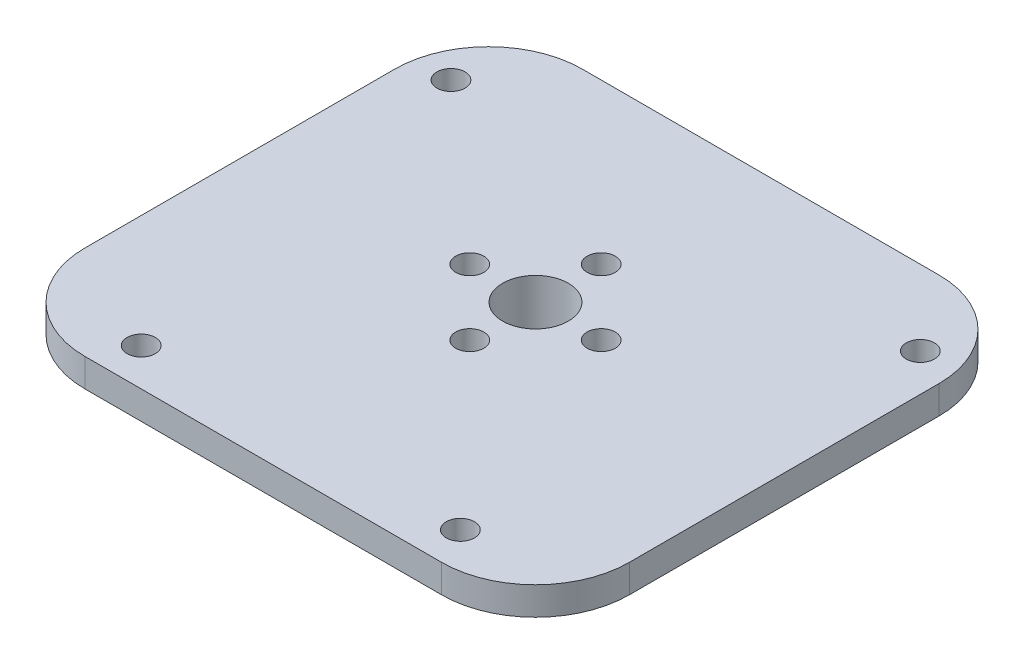
ISO-10303-21;
HEADER;
FILE_DESCRIPTION(('STEP AP214'),'2;1');
FILE_NAME('part.step','',(''),(''),'','','');
FILE_SCHEMA(('AUTOMOTIVE_DESIGN { 1 0 10303 214 1 1 1 1 }'));
ENDSEC;
DATA;
#1=APPLICATION_CONTEXT('core data for automotive mechanical design processes');
#2=APPLICATION_PROTOCOL_DEFINITION('international standard','automotive_design',2000,#1);
#3=PRODUCT_CONTEXT('',#1,'mechanical');
#4=PRODUCT('Part','Part','',(#3));
#5=PRODUCT_RELATED_PRODUCT_CATEGORY('part','',(#4));
#6=PRODUCT_DEFINITION_FORMATION('','',#4);
#7=PRODUCT_DEFINITION_CONTEXT('part definition',#1,'design');
#8=PRODUCT_DEFINITION('design','',#6,#7);
#9=PRODUCT_DEFINITION_SHAPE('','',#8);
#10=(LENGTH_UNIT() NAMED_UNIT(*) SI_UNIT(.MILLI.,.METRE.));
#11=(NAMED_UNIT(*) PLANE_ANGLE_UNIT() SI_UNIT($,.RADIAN.));
#12=(NAMED_UNIT(*) SI_UNIT($,.STERADIAN.) SOLID_ANGLE_UNIT());
#13=UNCERTAINTY_MEASURE_WITH_UNIT(LENGTH_MEASURE(1.E-05),#10,'distance_accuracy_value','');
#14=(GEOMETRIC_REPRESENTATION_CONTEXT(3) GLOBAL_UNCERTAINTY_ASSIGNED_CONTEXT((#13)) GLOBAL_UNIT_ASSIGNED_CONTEXT((#10,
#11,#12)) REPRESENTATION_CONTEXT('',''));
#15=CARTESIAN_POINT('',(0.,0.,0.));
#16=DIRECTION('',(0.,0.,1.));
#17=DIRECTION('',(1.,0.,0.));
#18=AXIS2_PLACEMENT_3D('',#15,#16,#17);
#19=CARTESIAN_POINT('',(0.,0.,0.));
#20=DIRECTION('',(0.,-1.,0.));
#21=DIRECTION('',(0.,0.,-1.));
#22=AXIS2_PLACEMENT_3D('',#19,#20,#21);
#23=PLANE('',#22);
#24=DIRECTION('',(1.,0.,0.));
#25=VECTOR('',#24,1.);
#26=CARTESIAN_POINT('',(-29.,0.,29.));
#27=LINE('',#26,#25);
#28=CARTESIAN_POINT('',(-19.,0.,29.));
#29=VERTEX_POINT('',#28);
#30=CARTESIAN_POINT('',(19.,0.,29.));
#31=VERTEX_POINT('',#30);
#32=EDGE_CURVE('E219',#29,#31,#27,.T.);
#33=ORIENTED_EDGE('',*,*,#32,.F.);
#34=CARTESIAN_POINT('',(-19.,0.,19.));
#35=DIRECTION('',(0.,-1.,0.));
#36=DIRECTION('',(0.,0.,-1.));
#37=AXIS2_PLACEMENT_3D('',#34,#35,#36);
#38=CIRCLE('',#37,10.);
#39=CARTESIAN_POINT('',(-29.,0.,19.));
#40=VERTEX_POINT('',#39);
#41=EDGE_CURVE('E244',#29,#40,#38,.T.);
#42=ORIENTED_EDGE('',*,*,#41,.T.);
#43=DIRECTION('',(0.,0.,1.));
#44=VECTOR('',#43,1.);
#45=CARTESIAN_POINT('',(-29.,0.,29.));
#46=LINE('',#45,#44);
#47=CARTESIAN_POINT('',(-29.,0.,-14.));
#48=VERTEX_POINT('',#47);
#49=EDGE_CURVE('E226',#48,#40,#46,.T.);
#50=ORIENTED_EDGE('',*,*,#49,.F.);
#51=CARTESIAN_POINT('',(-19.,0.,-14.));
#52=DIRECTION('',(0.,-1.,0.));
#53=DIRECTION('',(0.,0.,-1.));
#54=AXIS2_PLACEMENT_3D('',#51,#52,#53);
#55=CIRCLE('',#54,10.);
#56=CARTESIAN_POINT('',(-19.,0.,-24.));
#57=VERTEX_POINT('',#56);
#58=EDGE_CURVE('E142',#48,#57,#55,.T.);
#59=ORIENTED_EDGE('',*,*,#58,.T.);
#60=DIRECTION('',(-1.,0.,0.));
#61=VECTOR('',#60,1.);
#62=CARTESIAN_POINT('',(0.,0.,-24.));
#63=LINE('',#62,#61);
#64=CARTESIAN_POINT('',(-9.99999999999998,0.,-24.));
#65=VERTEX_POINT('',#64);
#66=EDGE_CURVE('E124',#65,#57,#63,.T.);
#67=ORIENTED_EDGE('',*,*,#66,.F.);
#68=CARTESIAN_POINT('',(0.,0.,0.));
#69=DIRECTION('',(0.,-1.,0.));
#70=DIRECTION('',(0.,0.,-1.));
#71=AXIS2_PLACEMENT_3D('',#68,#69,#70);
#72=CIRCLE('',#71,26.);
#73=CARTESIAN_POINT('',(9.99999999999998,0.,-24.));
#74=VERTEX_POINT('',#73);
#75=EDGE_CURVE('E139',#74,#65,#72,.T.);
#76=ORIENTED_EDGE('',*,*,#75,.F.);
#77=CARTESIAN_POINT('',(19.,0.,-24.));
#78=VERTEX_POINT('',#77);
#79=EDGE_CURVE('E143',#78,#74,#63,.T.);
#80=ORIENTED_EDGE('',*,*,#79,.F.);
#81=CARTESIAN_POINT('',(19.,0.,-14.));
#82=DIRECTION('',(0.,-1.,0.));
#83=DIRECTION('',(0.,0.,-1.));
#84=AXIS2_PLACEMENT_3D('',#81,#82,#83);
#85=CIRCLE('',#84,10.);
#86=CARTESIAN_POINT('',(29.,0.,-14.));
#87=VERTEX_POINT('',#86);
#88=EDGE_CURVE('E240',#78,#87,#85,.T.);
#89=ORIENTED_EDGE('',*,*,#88,.T.);
#90=DIRECTION('',(0.,0.,-1.));
#91=VECTOR('',#90,1.);
#92=CARTESIAN_POINT('',(29.,0.,29.));
#93=LINE('',#92,#91);
#94=CARTESIAN_POINT('',(29.,0.,19.));
#95=VERTEX_POINT('',#94);
#96=EDGE_CURVE('E215',#95,#87,#93,.T.);
#97=ORIENTED_EDGE('',*,*,#96,.F.);
#98=CARTESIAN_POINT('',(19.,0.,19.));
#99=DIRECTION('',(0.,-1.,0.));
#100=DIRECTION('',(0.,0.,-1.));
#101=AXIS2_PLACEMENT_3D('',#98,#99,#100);
#102=CIRCLE('',#101,10.);
#103=EDGE_CURVE('E242',#95,#31,#102,.T.);
#104=ORIENTED_EDGE('',*,*,#103,.T.);
#105=EDGE_LOOP('',(#33,#42,#50,#59,#67,#76,#80,#89,#97,#104));
#106=FACE_BOUND('',#105,.T.);
#107=CARTESIAN_POINT('',(-25.,0.,-16.));
#108=DIRECTION('',(0.,1.,0.));
#109=DIRECTION('',(0.,0.,-1.));
#110=AXIS2_PLACEMENT_3D('',#107,#108,#109);
#111=CIRCLE('',#110,1.5);
#112=CARTESIAN_POINT('',(-25.,0.,-17.5));
#113=VERTEX_POINT('',#112);
#114=EDGE_CURVE('E176',#113,#113,#111,.T.);
#115=ORIENTED_EDGE('',*,*,#114,.T.);
#116=EDGE_LOOP('',(#115));
#117=FACE_BOUND('',#116,.T.);
#118=CARTESIAN_POINT('',(17.,0.,25.));
#119=DIRECTION('',(0.,1.,0.));
#120=DIRECTION('',(0.,0.,1.));
#121=AXIS2_PLACEMENT_3D('',#118,#119,#120);
#122=CIRCLE('',#121,1.5);
#123=CARTESIAN_POINT('',(17.,0.,26.5));
#124=VERTEX_POINT('',#123);
#125=EDGE_CURVE('E186',#124,#124,#122,.T.);
#126=ORIENTED_EDGE('',*,*,#125,.T.);
#127=EDGE_LOOP('',(#126));
#128=FACE_BOUND('',#127,.T.);
#129=CARTESIAN_POINT('',(25.,0.,-16.));
#130=DIRECTION('',(0.,1.,0.));
#131=DIRECTION('',(0.,0.,1.));
#132=AXIS2_PLACEMENT_3D('',#129,#130,#131);
#133=CIRCLE('',#132,1.5);
#134=CARTESIAN_POINT('',(25.,0.,-14.5));
#135=VERTEX_POINT('',#134);
#136=EDGE_CURVE('E192',#135,#135,#133,.T.);
#137=ORIENTED_EDGE('',*,*,#136,.T.);
#138=EDGE_LOOP('',(#137));
#139=FACE_BOUND('',#138,.T.);
#140=CARTESIAN_POINT('',(-17.,0.,25.));
#141=DIRECTION('',(0.,1.,0.));
#142=DIRECTION('',(0.,0.,-1.));
#143=AXIS2_PLACEMENT_3D('',#140,#141,#142);
#144=CIRCLE('',#143,1.5);
#145=CARTESIAN_POINT('',(-17.,0.,23.5));
#146=VERTEX_POINT('',#145);
#147=EDGE_CURVE('E180',#146,#146,#144,.T.);
#148=ORIENTED_EDGE('',*,*,#147,.T.);
#149=EDGE_LOOP('',(#148));
#150=FACE_BOUND('',#149,.T.);
#151=ADVANCED_FACE('F43',(#106,#117,#128,#139,#150),#23,.T.);
#152=CARTESIAN_POINT('',(0.,3.,0.));
#153=DIRECTION('',(0.,-1.,0.));
#154=DIRECTION('',(0.,0.,-1.));
#155=AXIS2_PLACEMENT_3D('',#152,#153,#154);
#156=PLANE('',#155);
#157=DIRECTION('',(0.,0.,1.));
#158=VECTOR('',#157,1.);
#159=CARTESIAN_POINT('',(-29.,3.,29.));
#160=LINE('',#159,#158);
#161=CARTESIAN_POINT('',(-29.,3.,-14.));
#162=VERTEX_POINT('',#161);
#163=CARTESIAN_POINT('',(-29.,3.,19.));
#164=VERTEX_POINT('',#163);
#165=EDGE_CURVE('E218',#162,#164,#160,.T.);
#166=ORIENTED_EDGE('',*,*,#165,.T.);
#167=CARTESIAN_POINT('',(-19.,3.,19.));
#168=DIRECTION('',(0.,-1.,0.));
#169=DIRECTION('',(0.,0.,-1.));
#170=AXIS2_PLACEMENT_3D('',#167,#168,#169);
#171=CIRCLE('',#170,10.);
#172=CARTESIAN_POINT('',(-19.,3.,29.));
#173=VERTEX_POINT('',#172);
#174=EDGE_CURVE('E254',#164,#173,#171,.F.);
#175=ORIENTED_EDGE('',*,*,#174,.T.);
#176=DIRECTION('',(1.,0.,0.));
#177=VECTOR('',#176,1.);
#178=CARTESIAN_POINT('',(-29.,3.,29.));
#179=LINE('',#178,#177);
#180=CARTESIAN_POINT('',(19.,3.,29.));
#181=VERTEX_POINT('',#180);
#182=EDGE_CURVE('E132',#173,#181,#179,.T.);
#183=ORIENTED_EDGE('',*,*,#182,.T.);
#184=CARTESIAN_POINT('',(19.,3.,19.));
#185=DIRECTION('',(0.,-1.,0.));
#186=DIRECTION('',(0.,0.,-1.));
#187=AXIS2_PLACEMENT_3D('',#184,#185,#186);
#188=CIRCLE('',#187,10.);
#189=CARTESIAN_POINT('',(29.,3.,19.));
#190=VERTEX_POINT('',#189);
#191=EDGE_CURVE('E252',#181,#190,#188,.F.);
#192=ORIENTED_EDGE('',*,*,#191,.T.);
#193=DIRECTION('',(0.,0.,-1.));
#194=VECTOR('',#193,1.);
#195=CARTESIAN_POINT('',(29.,3.,29.));
#196=LINE('',#195,#194);
#197=CARTESIAN_POINT('',(29.,3.,-14.));
#198=VERTEX_POINT('',#197);
#199=EDGE_CURVE('E216',#190,#198,#196,.T.);
#200=ORIENTED_EDGE('',*,*,#199,.T.);
#201=CARTESIAN_POINT('',(19.,3.,-14.));
#202=DIRECTION('',(0.,-1.,0.));
#203=DIRECTION('',(0.,0.,-1.));
#204=AXIS2_PLACEMENT_3D('',#201,#202,#203);
#205=CIRCLE('',#204,10.);
#206=CARTESIAN_POINT('',(19.,3.,-24.));
#207=VERTEX_POINT('',#206);
#208=EDGE_CURVE('E58',#198,#207,#205,.F.);
#209=ORIENTED_EDGE('',*,*,#208,.T.);
#210=DIRECTION('',(1.,0.,0.));
#211=VECTOR('',#210,1.);
#212=CARTESIAN_POINT('',(29.,3.,-24.));
#213=LINE('',#212,#211);
#214=CARTESIAN_POINT('',(-19.,3.,-24.));
#215=VERTEX_POINT('',#214);
#216=EDGE_CURVE('E261',#215,#207,#213,.T.);
#217=ORIENTED_EDGE('',*,*,#216,.F.);
#218=CARTESIAN_POINT('',(-19.,3.,-14.));
#219=DIRECTION('',(0.,-1.,0.));
#220=DIRECTION('',(0.,0.,-1.));
#221=AXIS2_PLACEMENT_3D('',#218,#219,#220);
#222=CIRCLE('',#221,10.);
#223=EDGE_CURVE('E66',#215,#162,#222,.F.);
#224=ORIENTED_EDGE('',*,*,#223,.T.);
#225=EDGE_LOOP('',(#166,#175,#183,#192,#200,#209,#217,#224));
#226=FACE_BOUND('',#225,.T.);
#227=CARTESIAN_POINT('',(0.,3.,-7.));
#228=DIRECTION('',(0.,1.,0.));
#229=DIRECTION('',(0.,0.,1.));
#230=AXIS2_PLACEMENT_3D('',#227,#228,#229);
#231=CIRCLE('',#230,1.5);
#232=CARTESIAN_POINT('',(0.,3.,-5.5));
#233=VERTEX_POINT('',#232);
#234=EDGE_CURVE('E212',#233,#233,#231,.T.);
#235=ORIENTED_EDGE('',*,*,#234,.F.);
#236=EDGE_LOOP('',(#235));
#237=FACE_BOUND('',#236,.T.);
#238=CARTESIAN_POINT('',(7.,3.,0.));
#239=DIRECTION('',(0.,1.,0.));
#240=DIRECTION('',(0.,0.,1.));
#241=AXIS2_PLACEMENT_3D('',#238,#239,#240);
#242=CIRCLE('',#241,1.5);
#243=CARTESIAN_POINT('',(7.,3.,1.5));
#244=VERTEX_POINT('',#243);
#245=EDGE_CURVE('E209',#244,#244,#242,.T.);
#246=ORIENTED_EDGE('',*,*,#245,.F.);
#247=EDGE_LOOP('',(#246));
#248=FACE_BOUND('',#247,.T.);
#249=CARTESIAN_POINT('',(0.,3.,0.));
#250=DIRECTION('',(0.,1.,0.));
#251=DIRECTION('',(0.,0.,1.));
#252=AXIS2_PLACEMENT_3D('',#249,#250,#251);
#253=CIRCLE('',#252,3.5);
#254=CARTESIAN_POINT('',(0.,3.,3.49999999999999));
#255=VERTEX_POINT('',#254);
#256=EDGE_CURVE('E206',#255,#255,#253,.T.);
#257=ORIENTED_EDGE('',*,*,#256,.F.);
#258=EDGE_LOOP('',(#257));
#259=FACE_BOUND('',#258,.T.);
#260=CARTESIAN_POINT('',(0.,3.,7.));
#261=DIRECTION('',(0.,1.,0.));
#262=DIRECTION('',(0.,0.,-1.));
#263=AXIS2_PLACEMENT_3D('',#260,#261,#262);
#264=CIRCLE('',#263,1.5);
#265=CARTESIAN_POINT('',(0.,3.,5.5));
#266=VERTEX_POINT('',#265);
#267=EDGE_CURVE('E203',#266,#266,#264,.T.);
#268=ORIENTED_EDGE('',*,*,#267,.F.);
#269=EDGE_LOOP('',(#268));
#270=FACE_BOUND('',#269,.T.);
#271=CARTESIAN_POINT('',(-7.,3.,0.));
#272=DIRECTION('',(0.,1.,0.));
#273=DIRECTION('',(0.,0.,-1.));
#274=AXIS2_PLACEMENT_3D('',#271,#272,#273);
#275=CIRCLE('',#274,1.5);
#276=CARTESIAN_POINT('',(-7.,3.,-1.5));
#277=VERTEX_POINT('',#276);
#278=EDGE_CURVE('E198',#277,#277,#275,.T.);
#279=ORIENTED_EDGE('',*,*,#278,.F.);
#280=EDGE_LOOP('',(#279));
#281=FACE_BOUND('',#280,.T.);
#282=CARTESIAN_POINT('',(25.,3.,-16.));
#283=DIRECTION('',(0.,1.,0.));
#284=DIRECTION('',(0.,0.,1.));
#285=AXIS2_PLACEMENT_3D('',#282,#283,#284);
#286=CIRCLE('',#285,1.5);
#287=CARTESIAN_POINT('',(25.,3.,-14.5));
#288=VERTEX_POINT('',#287);
#289=EDGE_CURVE('E195',#288,#288,#286,.T.);
#290=ORIENTED_EDGE('',*,*,#289,.F.);
#291=EDGE_LOOP('',(#290));
#292=FACE_BOUND('',#291,.T.);
#293=CARTESIAN_POINT('',(17.,3.,25.));
#294=DIRECTION('',(0.,1.,0.));
#295=DIRECTION('',(0.,0.,1.));
#296=AXIS2_PLACEMENT_3D('',#293,#294,#295);
#297=CIRCLE('',#296,1.5);
#298=CARTESIAN_POINT('',(17.,3.,26.5));
#299=VERTEX_POINT('',#298);
#300=EDGE_CURVE('E189',#299,#299,#297,.T.);
#301=ORIENTED_EDGE('',*,*,#300,.F.);
#302=EDGE_LOOP('',(#301));
#303=FACE_BOUND('',#302,.T.);
#304=CARTESIAN_POINT('',(-17.,3.,25.));
#305=DIRECTION('',(0.,1.,0.));
#306=DIRECTION('',(0.,0.,-1.));
#307=AXIS2_PLACEMENT_3D('',#304,#305,#306);
#308=CIRCLE('',#307,1.5);
#309=CARTESIAN_POINT('',(-17.,3.,23.5));
#310=VERTEX_POINT('',#309);
#311=EDGE_CURVE('E183',#310,#310,#308,.T.);
#312=ORIENTED_EDGE('',*,*,#311,.F.);
#313=EDGE_LOOP('',(#312));
#314=FACE_BOUND('',#313,.T.);
#315=CARTESIAN_POINT('',(-25.,3.,-16.));
#316=DIRECTION('',(0.,1.,0.));
#317=DIRECTION('',(0.,0.,-1.));
#318=AXIS2_PLACEMENT_3D('',#315,#316,#317);
#319=CIRCLE('',#318,1.5);
#320=CARTESIAN_POINT('',(-25.,3.,-17.5));
#321=VERTEX_POINT('',#320);
#322=EDGE_CURVE('E177',#321,#321,#319,.T.);
#323=ORIENTED_EDGE('',*,*,#322,.F.);
#324=EDGE_LOOP('',(#323));
#325=FACE_BOUND('',#324,.T.);
#326=ADVANCED_FACE('F263',(#226,#237,#248,#259,#270,#281,#292,#303,#314,#325),#156,.F.);
#327=CARTESIAN_POINT('',(29.,3.,29.));
#328=DIRECTION('',(-1.,0.,0.));
#329=DIRECTION('',(0.,0.,1.));
#330=AXIS2_PLACEMENT_3D('',#327,#328,#329);
#331=PLANE('',#330);
#332=ORIENTED_EDGE('',*,*,#199,.F.);
#333=DIRECTION('',(0.,-1.,0.));
#334=VECTOR('',#333,1.);
#335=CARTESIAN_POINT('',(29.,3.,19.));
#336=LINE('',#335,#334);
#337=EDGE_CURVE('E259',#190,#95,#336,.T.);
#338=ORIENTED_EDGE('',*,*,#337,.T.);
#339=ORIENTED_EDGE('',*,*,#96,.T.);
#340=DIRECTION('',(0.,1.,0.));
#341=VECTOR('',#340,1.);
#342=CARTESIAN_POINT('',(29.,3.,-14.));
#343=LINE('',#342,#341);
#344=EDGE_CURVE('E256',#87,#198,#343,.T.);
#345=ORIENTED_EDGE('',*,*,#344,.T.);
#346=EDGE_LOOP('',(#332,#338,#339,#345));
#347=FACE_BOUND('',#346,.T.);
#348=ADVANCED_FACE('F285',(#347),#331,.F.);
#349=CARTESIAN_POINT('',(-29.,3.,29.));
#350=DIRECTION('',(1.,0.,0.));
#351=DIRECTION('',(0.,0.,-1.));
#352=AXIS2_PLACEMENT_3D('',#349,#350,#351);
#353=PLANE('',#352);
#354=ORIENTED_EDGE('',*,*,#49,.T.);
#355=DIRECTION('',(0.,-1.,0.));
#356=VECTOR('',#355,1.);
#357=CARTESIAN_POINT('',(-29.,3.,19.));
#358=LINE('',#357,#356);
#359=EDGE_CURVE('E248',#40,#164,#358,.F.);
#360=ORIENTED_EDGE('',*,*,#359,.T.);
#361=ORIENTED_EDGE('',*,*,#165,.F.);
#362=DIRECTION('',(0.,1.,0.));
#363=VECTOR('',#362,1.);
#364=CARTESIAN_POINT('',(-29.,3.,-14.));
#365=LINE('',#364,#363);
#366=EDGE_CURVE('E246',#162,#48,#365,.F.);
#367=ORIENTED_EDGE('',*,*,#366,.T.);
#368=EDGE_LOOP('',(#354,#360,#361,#367));
#369=FACE_BOUND('',#368,.T.);
#370=ADVANCED_FACE('F270',(#369),#353,.F.);
#371=CARTESIAN_POINT('',(-29.,3.,29.));
#372=DIRECTION('',(0.,0.,-1.));
#373=DIRECTION('',(-1.,0.,0.));
#374=AXIS2_PLACEMENT_3D('',#371,#372,#373);
#375=PLANE('',#374);
#376=ORIENTED_EDGE('',*,*,#182,.F.);
#377=DIRECTION('',(0.,-1.,0.));
#378=VECTOR('',#377,1.);
#379=CARTESIAN_POINT('',(-19.,3.,29.));
#380=LINE('',#379,#378);
#381=EDGE_CURVE('E236',#173,#29,#380,.T.);
#382=ORIENTED_EDGE('',*,*,#381,.T.);
#383=ORIENTED_EDGE('',*,*,#32,.T.);
#384=DIRECTION('',(0.,-1.,0.));
#385=VECTOR('',#384,1.);
#386=CARTESIAN_POINT('',(19.,3.,29.));
#387=LINE('',#386,#385);
#388=EDGE_CURVE('E234',#31,#181,#387,.F.);
#389=ORIENTED_EDGE('',*,*,#388,.T.);
#390=EDGE_LOOP('',(#376,#382,#383,#389));
#391=FACE_BOUND('',#390,.T.);
#392=ADVANCED_FACE('F289',(#391),#375,.F.);
#393=CARTESIAN_POINT('',(0.,3.,-7.));
#394=DIRECTION('',(0.,-1.,0.));
#395=DIRECTION('',(0.,0.,-1.));
#396=AXIS2_PLACEMENT_3D('',#393,#394,#395);
#397=CYLINDRICAL_SURFACE('',#396,1.5);
#398=ORIENTED_EDGE('',*,*,#234,.T.);
#399=EDGE_LOOP('',(#398));
#400=FACE_BOUND('',#399,.T.);
#401=CARTESIAN_POINT('',(0.,-5.,-7.));
#402=DIRECTION('',(0.,-1.,0.));
#403=DIRECTION('',(0.,0.,-1.));
#404=AXIS2_PLACEMENT_3D('',#401,#402,#403);
#405=CIRCLE('',#404,1.5);
#406=CARTESIAN_POINT('',(0.,-5.,-8.5));
#407=VERTEX_POINT('',#406);
#408=EDGE_CURVE('E170',#407,#407,#405,.F.);
#409=ORIENTED_EDGE('',*,*,#408,.F.);
#410=EDGE_LOOP('',(#409));
#411=FACE_BOUND('',#410,.T.);
#412=ADVANCED_FACE('F292',(#400,#411),#397,.F.);
#413=CARTESIAN_POINT('',(7.,3.,0.));
#414=DIRECTION('',(0.,-1.,0.));
#415=DIRECTION('',(0.,0.,-1.));
#416=AXIS2_PLACEMENT_3D('',#413,#414,#415);
#417=CYLINDRICAL_SURFACE('',#416,1.5);
#418=ORIENTED_EDGE('',*,*,#245,.T.);
#419=EDGE_LOOP('',(#418));
#420=FACE_BOUND('',#419,.T.);
#421=CARTESIAN_POINT('',(7.,-5.,0.));
#422=DIRECTION('',(0.,-1.,0.));
#423=DIRECTION('',(0.,0.,-1.));
#424=AXIS2_PLACEMENT_3D('',#421,#422,#423);
#425=CIRCLE('',#424,1.5);
#426=CARTESIAN_POINT('',(7.,-5.,-1.5));
#427=VERTEX_POINT('',#426);
#428=EDGE_CURVE('E173',#427,#427,#425,.F.);
#429=ORIENTED_EDGE('',*,*,#428,.F.);
#430=EDGE_LOOP('',(#429));
#431=FACE_BOUND('',#430,.T.);
#432=ADVANCED_FACE('F374',(#420,#431),#417,.F.);
#433=CARTESIAN_POINT('',(0.,3.,0.));
#434=DIRECTION('',(0.,-1.,0.));
#435=DIRECTION('',(0.,0.,-1.));
#436=AXIS2_PLACEMENT_3D('',#433,#434,#435);
#437=CYLINDRICAL_SURFACE('',#436,3.5);
#438=ORIENTED_EDGE('',*,*,#256,.T.);
#439=EDGE_LOOP('',(#438));
#440=FACE_BOUND('',#439,.T.);
#441=CARTESIAN_POINT('',(0.,-5.,0.));
#442=DIRECTION('',(0.,-1.,0.));
#443=DIRECTION('',(0.,0.,-1.));
#444=AXIS2_PLACEMENT_3D('',#441,#442,#443);
#445=CIRCLE('',#444,3.5);
#446=CARTESIAN_POINT('',(0.,-5.,-3.50000000000001));
#447=VERTEX_POINT('',#446);
#448=EDGE_CURVE('E164',#447,#447,#445,.F.);
#449=ORIENTED_EDGE('',*,*,#448,.F.);
#450=EDGE_LOOP('',(#449));
#451=FACE_BOUND('',#450,.T.);
#452=ADVANCED_FACE('F370',(#440,#451),#437,.F.);
#453=CARTESIAN_POINT('',(0.,3.,7.));
#454=DIRECTION('',(0.,-1.,0.));
#455=DIRECTION('',(0.,0.,-1.));
#456=AXIS2_PLACEMENT_3D('',#453,#454,#455);
#457=CYLINDRICAL_SURFACE('',#456,1.5);
#458=ORIENTED_EDGE('',*,*,#267,.T.);
#459=EDGE_LOOP('',(#458));
#460=FACE_BOUND('',#459,.T.);
#461=CARTESIAN_POINT('',(0.,-5.,7.));
#462=DIRECTION('',(0.,-1.,0.));
#463=DIRECTION('',(0.,0.,-1.));
#464=AXIS2_PLACEMENT_3D('',#461,#462,#463);
#465=CIRCLE('',#464,1.5);
#466=CARTESIAN_POINT('',(0.,-5.,5.5));
#467=VERTEX_POINT('',#466);
#468=EDGE_CURVE('E161',#467,#467,#465,.F.);
#469=ORIENTED_EDGE('',*,*,#468,.F.);
#470=EDGE_LOOP('',(#469));
#471=FACE_BOUND('',#470,.T.);
#472=ADVANCED_FACE('F366',(#460,#471),#457,.F.);
#473=CARTESIAN_POINT('',(-7.,3.,0.));
#474=DIRECTION('',(0.,-1.,0.));
#475=DIRECTION('',(0.,0.,-1.));
#476=AXIS2_PLACEMENT_3D('',#473,#474,#475);
#477=CYLINDRICAL_SURFACE('',#476,1.5);
#478=ORIENTED_EDGE('',*,*,#278,.T.);
#479=EDGE_LOOP('',(#478));
#480=FACE_BOUND('',#479,.T.);
#481=CARTESIAN_POINT('',(-7.,-5.,0.));
#482=DIRECTION('',(0.,-1.,0.));
#483=DIRECTION('',(0.,0.,-1.));
#484=AXIS2_PLACEMENT_3D('',#481,#482,#483);
#485=CIRCLE('',#484,1.5);
#486=CARTESIAN_POINT('',(-7.,-5.,-1.5));
#487=VERTEX_POINT('',#486);
#488=EDGE_CURVE('E167',#487,#487,#485,.F.);
#489=ORIENTED_EDGE('',*,*,#488,.F.);
#490=EDGE_LOOP('',(#489));
#491=FACE_BOUND('',#490,.T.);
#492=ADVANCED_FACE('F362',(#480,#491),#477,.F.);
#493=CARTESIAN_POINT('',(25.,3.,-16.));
#494=DIRECTION('',(0.,-1.,0.));
#495=DIRECTION('',(0.,0.,-1.));
#496=AXIS2_PLACEMENT_3D('',#493,#494,#495);
#497=CYLINDRICAL_SURFACE('',#496,1.5);
#498=ORIENTED_EDGE('',*,*,#289,.T.);
#499=EDGE_LOOP('',(#498));
#500=FACE_BOUND('',#499,.T.);
#501=ORIENTED_EDGE('',*,*,#136,.F.);
#502=EDGE_LOOP('',(#501));
#503=FACE_BOUND('',#502,.T.);
#504=ADVANCED_FACE('F358',(#500,#503),#497,.F.);
#505=CARTESIAN_POINT('',(17.,3.,25.));
#506=DIRECTION('',(0.,-1.,0.));
#507=DIRECTION('',(0.,0.,-1.));
#508=AXIS2_PLACEMENT_3D('',#505,#506,#507);
#509=CYLINDRICAL_SURFACE('',#508,1.5);
#510=ORIENTED_EDGE('',*,*,#300,.T.);
#511=EDGE_LOOP('',(#510));
#512=FACE_BOUND('',#511,.T.);
#513=ORIENTED_EDGE('',*,*,#125,.F.);
#514=EDGE_LOOP('',(#513));
#515=FACE_BOUND('',#514,.T.);
#516=ADVANCED_FACE('F354',(#512,#515),#509,.F.);
#517=CARTESIAN_POINT('',(-17.,3.,25.));
#518=DIRECTION('',(0.,-1.,0.));
#519=DIRECTION('',(0.,0.,-1.));
#520=AXIS2_PLACEMENT_3D('',#517,#518,#519);
#521=CYLINDRICAL_SURFACE('',#520,1.5);
#522=ORIENTED_EDGE('',*,*,#311,.T.);
#523=EDGE_LOOP('',(#522));
#524=FACE_BOUND('',#523,.T.);
#525=ORIENTED_EDGE('',*,*,#147,.F.);
#526=EDGE_LOOP('',(#525));
#527=FACE_BOUND('',#526,.T.);
#528=ADVANCED_FACE('F350',(#524,#527),#521,.F.);
#529=CARTESIAN_POINT('',(-25.,3.,-16.));
#530=DIRECTION('',(0.,-1.,0.));
#531=DIRECTION('',(0.,0.,-1.));
#532=AXIS2_PLACEMENT_3D('',#529,#530,#531);
#533=CYLINDRICAL_SURFACE('',#532,1.5);
#534=ORIENTED_EDGE('',*,*,#322,.T.);
#535=EDGE_LOOP('',(#534));
#536=FACE_BOUND('',#535,.T.);
#537=ORIENTED_EDGE('',*,*,#114,.F.);
#538=EDGE_LOOP('',(#537));
#539=FACE_BOUND('',#538,.T.);
#540=ADVANCED_FACE('F346',(#536,#539),#533,.F.);
#541=CARTESIAN_POINT('',(0.,-5.,0.));
#542=DIRECTION('',(0.,-1.,0.));
#543=DIRECTION('',(0.,0.,-1.));
#544=AXIS2_PLACEMENT_3D('',#541,#542,#543);
#545=PLANE('',#544);
#546=ORIENTED_EDGE('',*,*,#468,.T.);
#547=EDGE_LOOP('',(#546));
#548=FACE_BOUND('',#547,.T.);
#549=ORIENTED_EDGE('',*,*,#448,.T.);
#550=EDGE_LOOP('',(#549));
#551=FACE_BOUND('',#550,.T.);
#552=ORIENTED_EDGE('',*,*,#488,.T.);
#553=EDGE_LOOP('',(#552));
#554=FACE_BOUND('',#553,.T.);
#555=ORIENTED_EDGE('',*,*,#408,.T.);
#556=EDGE_LOOP('',(#555));
#557=FACE_BOUND('',#556,.T.);
#558=ORIENTED_EDGE('',*,*,#428,.T.);
#559=EDGE_LOOP('',(#558));
#560=FACE_BOUND('',#559,.T.);
#561=CARTESIAN_POINT('',(0.,-5.,0.));
#562=DIRECTION('',(0.,-1.,0.));
#563=DIRECTION('',(0.,0.,-1.));
#564=AXIS2_PLACEMENT_3D('',#561,#562,#563);
#565=CIRCLE('',#564,12.5);
#566=CARTESIAN_POINT('',(0.,-5.,-12.5));
#567=VERTEX_POINT('',#566);
#568=EDGE_CURVE('E158',#567,#567,#565,.F.);
#569=ORIENTED_EDGE('',*,*,#568,.F.);
#570=EDGE_LOOP('',(#569));
#571=FACE_BOUND('',#570,.T.);
#572=ADVANCED_FACE('F333',(#548,#551,#554,#557,#560,#571),#545,.T.);
#573=CARTESIAN_POINT('',(0.,-7.,0.));
#574=DIRECTION('',(0.,-1.,0.));
#575=DIRECTION('',(0.,0.,-1.));
#576=AXIS2_PLACEMENT_3D('',#573,#574,#575);
#577=PLANE('',#576);
#578=CARTESIAN_POINT('',(0.,-7.,0.));
#579=DIRECTION('',(0.,-1.,0.));
#580=DIRECTION('',(0.,0.,-1.));
#581=AXIS2_PLACEMENT_3D('',#578,#579,#580);
#582=CIRCLE('',#581,17.);
#583=CARTESIAN_POINT('',(0.,-7.,-17.));
#584=VERTEX_POINT('',#583);
#585=EDGE_CURVE('E155',#584,#584,#582,.T.);
#586=ORIENTED_EDGE('',*,*,#585,.T.);
#587=EDGE_LOOP('',(#586));
#588=FACE_BOUND('',#587,.T.);
#589=CARTESIAN_POINT('',(0.,-7.,0.));
#590=DIRECTION('',(0.,-1.,0.));
#591=DIRECTION('',(0.,0.,-1.));
#592=AXIS2_PLACEMENT_3D('',#589,#590,#591);
#593=CIRCLE('',#592,12.5);
#594=CARTESIAN_POINT('',(0.,-7.,-12.5));
#595=VERTEX_POINT('',#594);
#596=EDGE_CURVE('E152',#595,#595,#593,.T.);
#597=ORIENTED_EDGE('',*,*,#596,.F.);
#598=EDGE_LOOP('',(#597));
#599=FACE_BOUND('',#598,.T.);
#600=ADVANCED_FACE('F327',(#588,#599),#577,.T.);
#601=CARTESIAN_POINT('',(0.,-7.,0.));
#602=DIRECTION('',(0.,1.,0.));
#603=DIRECTION('',(0.,0.,1.));
#604=AXIS2_PLACEMENT_3D('',#601,#602,#603);
#605=CYLINDRICAL_SURFACE('',#604,17.);
#606=CARTESIAN_POINT('',(0.,-2.,0.));
#607=DIRECTION('',(0.,-1.,0.));
#608=DIRECTION('',(0.,0.,-1.));
#609=AXIS2_PLACEMENT_3D('',#606,#607,#608);
#610=CIRCLE('',#609,17.);
#611=CARTESIAN_POINT('',(0.,-2.,-17.));
#612=VERTEX_POINT('',#611);
#613=EDGE_CURVE('E149',#612,#612,#610,.T.);
#614=ORIENTED_EDGE('',*,*,#613,.T.);
#615=EDGE_LOOP('',(#614));
#616=FACE_BOUND('',#615,.T.);
#617=ORIENTED_EDGE('',*,*,#585,.F.);
#618=EDGE_LOOP('',(#617));
#619=FACE_BOUND('',#618,.T.);
#620=ADVANCED_FACE('F324',(#616,#619),#605,.T.);
#621=CARTESIAN_POINT('',(0.,-7.,0.));
#622=DIRECTION('',(0.,1.,0.));
#623=DIRECTION('',(0.,0.,1.));
#624=AXIS2_PLACEMENT_3D('',#621,#622,#623);
#625=CYLINDRICAL_SURFACE('',#624,12.5);
#626=ORIENTED_EDGE('',*,*,#568,.T.);
#627=EDGE_LOOP('',(#626));
#628=FACE_BOUND('',#627,.T.);
#629=ORIENTED_EDGE('',*,*,#596,.T.);
#630=EDGE_LOOP('',(#629));
#631=FACE_BOUND('',#630,.T.);
#632=ADVANCED_FACE('F320',(#628,#631),#625,.F.);
#633=CARTESIAN_POINT('',(0.,-2.,0.));
#634=DIRECTION('',(0.,-1.,0.));
#635=DIRECTION('',(0.,0.,-1.));
#636=AXIS2_PLACEMENT_3D('',#633,#634,#635);
#637=PLANE('',#636);
#638=DIRECTION('',(-1.,0.,0.));
#639=VECTOR('',#638,1.);
#640=CARTESIAN_POINT('',(0.,-2.,-24.));
#641=LINE('',#640,#639);
#642=CARTESIAN_POINT('',(9.99999999999998,-2.,-24.));
#643=VERTEX_POINT('',#642);
#644=CARTESIAN_POINT('',(-9.99999999999998,-2.,-24.));
#645=VERTEX_POINT('',#644);
#646=EDGE_CURVE('E126',#643,#645,#641,.T.);
#647=ORIENTED_EDGE('',*,*,#646,.F.);
#648=CARTESIAN_POINT('',(0.,-2.,0.));
#649=DIRECTION('',(0.,-1.,0.));
#650=DIRECTION('',(0.,0.,-1.));
#651=AXIS2_PLACEMENT_3D('',#648,#649,#650);
#652=CIRCLE('',#651,26.);
#653=EDGE_CURVE('E147',#643,#645,#652,.T.);
#654=ORIENTED_EDGE('',*,*,#653,.T.);
#655=EDGE_LOOP('',(#647,#654));
#656=FACE_BOUND('',#655,.T.);
#657=ORIENTED_EDGE('',*,*,#613,.F.);
#658=EDGE_LOOP('',(#657));
#659=FACE_BOUND('',#658,.T.);
#660=ADVANCED_FACE('F317',(#656,#659),#637,.T.);
#661=CARTESIAN_POINT('',(0.,-2.,0.));
#662=DIRECTION('',(0.,1.,0.));
#663=DIRECTION('',(0.,0.,1.));
#664=AXIS2_PLACEMENT_3D('',#661,#662,#663);
#665=CYLINDRICAL_SURFACE('',#664,26.);
#666=ORIENTED_EDGE('',*,*,#653,.F.);
#667=DIRECTION('',(0.,1.,0.));
#668=VECTOR('',#667,1.);
#669=CARTESIAN_POINT('',(9.99999999999998,-2.,-24.));
#670=LINE('',#669,#668);
#671=EDGE_CURVE('E131',#643,#74,#670,.T.);
#672=ORIENTED_EDGE('',*,*,#671,.T.);
#673=ORIENTED_EDGE('',*,*,#75,.T.);
#674=DIRECTION('',(0.,1.,0.));
#675=VECTOR('',#674,1.);
#676=CARTESIAN_POINT('',(-9.99999999999998,-2.,-24.));
#677=LINE('',#676,#675);
#678=EDGE_CURVE('E121',#65,#645,#677,.F.);
#679=ORIENTED_EDGE('',*,*,#678,.T.);
#680=EDGE_LOOP('',(#666,#672,#673,#679));
#681=FACE_BOUND('',#680,.T.);
#682=ADVANCED_FACE('F146',(#681),#665,.T.);
#683=CARTESIAN_POINT('',(29.,-7.,-24.));
#684=DIRECTION('',(0.,0.,1.));
#685=DIRECTION('',(1.,0.,0.));
#686=AXIS2_PLACEMENT_3D('',#683,#684,#685);
#687=PLANE('',#686);
#688=ORIENTED_EDGE('',*,*,#216,.T.);
#689=DIRECTION('',(0.,1.,0.));
#690=VECTOR('',#689,1.);
#691=CARTESIAN_POINT('',(19.,-7.,-24.));
#692=LINE('',#691,#690);
#693=EDGE_CURVE('E11',#207,#78,#692,.F.);
#694=ORIENTED_EDGE('',*,*,#693,.T.);
#695=ORIENTED_EDGE('',*,*,#79,.T.);
#696=ORIENTED_EDGE('',*,*,#671,.F.);
#697=ORIENTED_EDGE('',*,*,#646,.T.);
#698=ORIENTED_EDGE('',*,*,#678,.F.);
#699=ORIENTED_EDGE('',*,*,#66,.T.);
#700=DIRECTION('',(0.,1.,0.));
#701=VECTOR('',#700,1.);
#702=CARTESIAN_POINT('',(-19.,-7.,-24.));
#703=LINE('',#702,#701);
#704=EDGE_CURVE('E51',#57,#215,#703,.T.);
#705=ORIENTED_EDGE('',*,*,#704,.T.);
#706=EDGE_LOOP('',(#688,#694,#695,#696,#697,#698,#699,#705));
#707=FACE_BOUND('',#706,.T.);
#708=ADVANCED_FACE('F123',(#707),#687,.F.);
#709=CARTESIAN_POINT('',(-19.,3.,19.));
#710=DIRECTION('',(0.,-1.,0.));
#711=DIRECTION('',(0.,0.,-1.));
#712=AXIS2_PLACEMENT_3D('',#709,#710,#711);
#713=CYLINDRICAL_SURFACE('',#712,10.);
#714=ORIENTED_EDGE('',*,*,#174,.F.);
#715=ORIENTED_EDGE('',*,*,#359,.F.);
#716=ORIENTED_EDGE('',*,*,#41,.F.);
#717=ORIENTED_EDGE('',*,*,#381,.F.);
#718=EDGE_LOOP('',(#714,#715,#716,#717));
#719=FACE_BOUND('',#718,.T.);
#720=ADVANCED_FACE('F299',(#719),#713,.T.);
#721=CARTESIAN_POINT('',(19.,3.,19.));
#722=DIRECTION('',(0.,-1.,0.));
#723=DIRECTION('',(0.,0.,-1.));
#724=AXIS2_PLACEMENT_3D('',#721,#722,#723);
#725=CYLINDRICAL_SURFACE('',#724,10.);
#726=ORIENTED_EDGE('',*,*,#191,.F.);
#727=ORIENTED_EDGE('',*,*,#388,.F.);
#728=ORIENTED_EDGE('',*,*,#103,.F.);
#729=ORIENTED_EDGE('',*,*,#337,.F.);
#730=EDGE_LOOP('',(#726,#727,#728,#729));
#731=FACE_BOUND('',#730,.T.);
#732=ADVANCED_FACE('F277',(#731),#725,.T.);
#733=CARTESIAN_POINT('',(19.,3.,-14.));
#734=DIRECTION('',(0.,1.,0.));
#735=DIRECTION('',(0.,0.,1.));
#736=AXIS2_PLACEMENT_3D('',#733,#734,#735);
#737=CYLINDRICAL_SURFACE('',#736,10.);
#738=ORIENTED_EDGE('',*,*,#88,.F.);
#739=ORIENTED_EDGE('',*,*,#693,.F.);
#740=ORIENTED_EDGE('',*,*,#208,.F.);
#741=ORIENTED_EDGE('',*,*,#344,.F.);
#742=EDGE_LOOP('',(#738,#739,#740,#741));
#743=FACE_BOUND('',#742,.T.);
#744=ADVANCED_FACE('F273',(#743),#737,.T.);
#745=CARTESIAN_POINT('',(-19.,-7.,-14.));
#746=DIRECTION('',(0.,1.,0.));
#747=DIRECTION('',(0.,0.,1.));
#748=AXIS2_PLACEMENT_3D('',#745,#746,#747);
#749=CYLINDRICAL_SURFACE('',#748,10.);
#750=ORIENTED_EDGE('',*,*,#58,.F.);
#751=ORIENTED_EDGE('',*,*,#366,.F.);
#752=ORIENTED_EDGE('',*,*,#223,.F.);
#753=ORIENTED_EDGE('',*,*,#704,.F.);
#754=EDGE_LOOP('',(#750,#751,#752,#753));
#755=FACE_BOUND('',#754,.T.);
#756=ADVANCED_FACE('F45',(#755),#749,.T.);
#757=CLOSED_SHELL('',(#151,#326,#348,#370,#392,#412,#432,#452,#472,#492,#504,#516,#528,#540,
#572,#600,#620,#632,#660,#682,#708,#720,#732,#744,#756));
#758=MANIFOLD_SOLID_BREP('B2',#757);
#759=ADVANCED_BREP_SHAPE_REPRESENTATION('',(#18,#758),#14);
#760=SHAPE_DEFINITION_REPRESENTATION(#9,#759);
ENDSEC;
END-ISO-10303-21;
